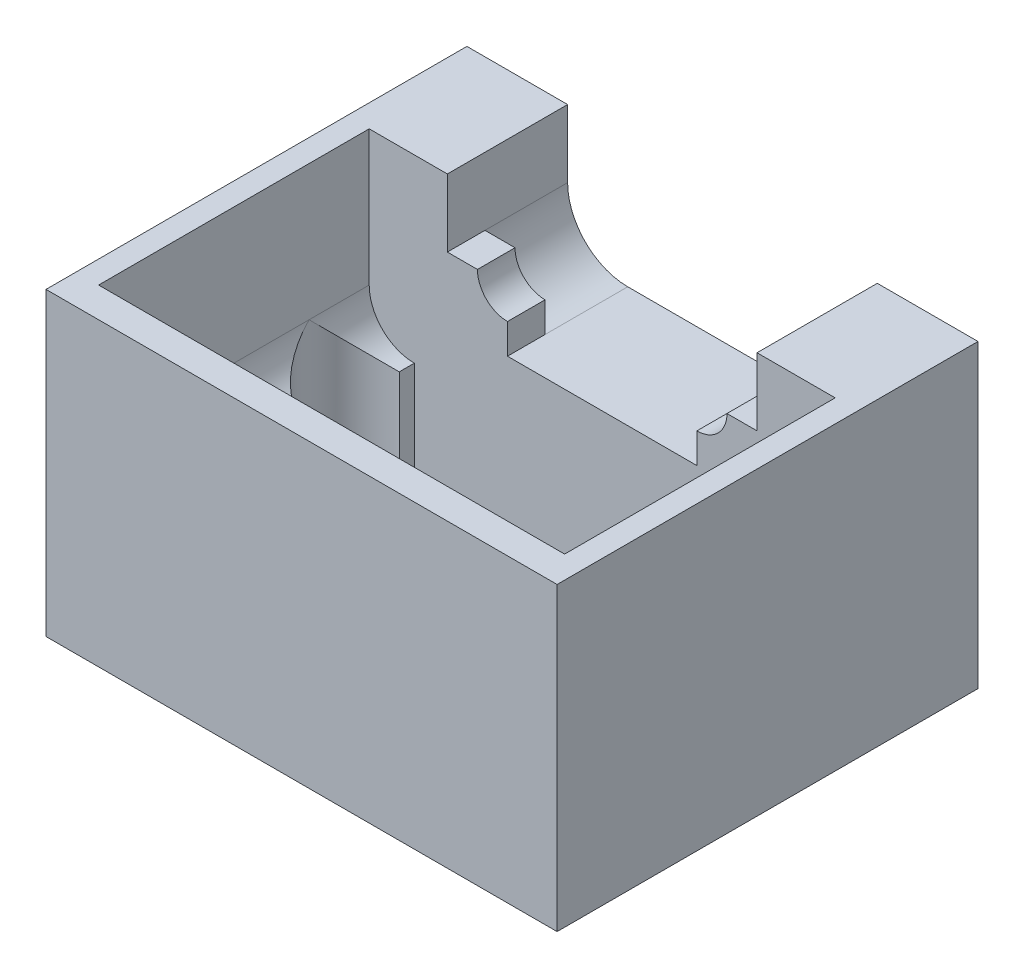
ISO-10303-21;
HEADER;
FILE_DESCRIPTION(('STEP AP214'),'2;1');
FILE_NAME('part.step','',(''),(''),'','','');
FILE_SCHEMA(('AUTOMOTIVE_DESIGN { 1 0 10303 214 1 1 1 1 }'));
ENDSEC;
DATA;
#1=APPLICATION_CONTEXT('core data for automotive mechanical design processes');
#2=APPLICATION_PROTOCOL_DEFINITION('international standard','automotive_design',2000,#1);
#3=PRODUCT_CONTEXT('',#1,'mechanical');
#4=PRODUCT('Part','Part','',(#3));
#5=PRODUCT_RELATED_PRODUCT_CATEGORY('part','',(#4));
#6=PRODUCT_DEFINITION_FORMATION('','',#4);
#7=PRODUCT_DEFINITION_CONTEXT('part definition',#1,'design');
#8=PRODUCT_DEFINITION('design','',#6,#7);
#9=PRODUCT_DEFINITION_SHAPE('','',#8);
#10=(LENGTH_UNIT() NAMED_UNIT(*) SI_UNIT(.MILLI.,.METRE.));
#11=(NAMED_UNIT(*) PLANE_ANGLE_UNIT() SI_UNIT($,.RADIAN.));
#12=(NAMED_UNIT(*) SI_UNIT($,.STERADIAN.) SOLID_ANGLE_UNIT());
#13=UNCERTAINTY_MEASURE_WITH_UNIT(LENGTH_MEASURE(1.E-05),#10,'distance_accuracy_value','');
#14=(GEOMETRIC_REPRESENTATION_CONTEXT(3) GLOBAL_UNCERTAINTY_ASSIGNED_CONTEXT((#13)) GLOBAL_UNIT_ASSIGNED_CONTEXT((#10,
#11,#12)) REPRESENTATION_CONTEXT('',''));
#15=CARTESIAN_POINT('',(0.,0.,0.));
#16=DIRECTION('',(0.,0.,1.));
#17=DIRECTION('',(1.,0.,0.));
#18=AXIS2_PLACEMENT_3D('',#15,#16,#17);
#19=CARTESIAN_POINT('',(6.3,11.5,-5.99999999999999));
#20=DIRECTION('',(1.,0.,0.));
#21=DIRECTION('',(0.,0.,-1.));
#22=AXIS2_PLACEMENT_3D('',#19,#20,#21);
#23=PLANE('',#22);
#24=DIRECTION('',(0.,1.,0.));
#25=VECTOR('',#24,1.);
#26=CARTESIAN_POINT('',(6.3,11.5,-8.5));
#27=LINE('',#26,#25);
#28=CARTESIAN_POINT('',(6.3,11.5,-8.5));
#29=VERTEX_POINT('',#28);
#30=CARTESIAN_POINT('',(6.3,13.5,-8.5));
#31=VERTEX_POINT('',#30);
#32=EDGE_CURVE('E296',#29,#31,#27,.T.);
#33=ORIENTED_EDGE('',*,*,#32,.F.);
#34=DIRECTION('',(0.,0.,-1.));
#35=VECTOR('',#34,1.);
#36=CARTESIAN_POINT('',(6.3,11.5,-5.99999999999999));
#37=LINE('',#36,#35);
#38=CARTESIAN_POINT('',(6.3,11.5,-5.99999999999999));
#39=VERTEX_POINT('',#38);
#40=EDGE_CURVE('E325',#39,#29,#37,.T.);
#41=ORIENTED_EDGE('',*,*,#40,.F.);
#42=DIRECTION('',(0.,1.,0.));
#43=VECTOR('',#42,1.);
#44=CARTESIAN_POINT('',(6.3,11.5,-5.99999999999999));
#45=LINE('',#44,#43);
#46=CARTESIAN_POINT('',(6.3,13.5,-6.));
#47=VERTEX_POINT('',#46);
#48=EDGE_CURVE('E334',#39,#47,#45,.T.);
#49=ORIENTED_EDGE('',*,*,#48,.T.);
#50=DIRECTION('',(0.,0.,1.));
#51=VECTOR('',#50,1.);
#52=CARTESIAN_POINT('',(6.3,13.5,-6.));
#53=LINE('',#52,#51);
#54=EDGE_CURVE('E48',#31,#47,#53,.T.);
#55=ORIENTED_EDGE('',*,*,#54,.F.);
#56=EDGE_LOOP('',(#33,#41,#49,#55));
#57=FACE_BOUND('',#56,.T.);
#58=ADVANCED_FACE('F39',(#57),#23,.F.);
#59=CARTESIAN_POINT('',(-6.3,11.5,-5.99999999999999));
#60=DIRECTION('',(-1.,0.,0.));
#61=DIRECTION('',(0.,0.,1.));
#62=AXIS2_PLACEMENT_3D('',#59,#60,#61);
#63=PLANE('',#62);
#64=DIRECTION('',(0.,-1.,0.));
#65=VECTOR('',#64,1.);
#66=CARTESIAN_POINT('',(-6.3,11.5,-8.5));
#67=LINE('',#66,#65);
#68=CARTESIAN_POINT('',(-6.3,13.5,-8.5));
#69=VERTEX_POINT('',#68);
#70=CARTESIAN_POINT('',(-6.3,11.5,-8.5));
#71=VERTEX_POINT('',#70);
#72=EDGE_CURVE('E311',#69,#71,#67,.T.);
#73=ORIENTED_EDGE('',*,*,#72,.F.);
#74=DIRECTION('',(0.,0.,1.));
#75=VECTOR('',#74,1.);
#76=CARTESIAN_POINT('',(-6.3,13.5,-6.));
#77=LINE('',#76,#75);
#78=CARTESIAN_POINT('',(-6.3,13.5,-6.));
#79=VERTEX_POINT('',#78);
#80=EDGE_CURVE('E532',#79,#69,#77,.F.);
#81=ORIENTED_EDGE('',*,*,#80,.F.);
#82=DIRECTION('',(0.,1.,0.));
#83=VECTOR('',#82,1.);
#84=CARTESIAN_POINT('',(-6.3,11.5,-5.99999999999999));
#85=LINE('',#84,#83);
#86=CARTESIAN_POINT('',(-6.3,11.5,-6.));
#87=VERTEX_POINT('',#86);
#88=EDGE_CURVE('E333',#87,#79,#85,.T.);
#89=ORIENTED_EDGE('',*,*,#88,.F.);
#90=DIRECTION('',(0.,0.,1.));
#91=VECTOR('',#90,1.);
#92=CARTESIAN_POINT('',(-6.3,11.5,-5.99999999999999));
#93=LINE('',#92,#91);
#94=EDGE_CURVE('E315',#71,#87,#93,.T.);
#95=ORIENTED_EDGE('',*,*,#94,.F.);
#96=EDGE_LOOP('',(#73,#81,#89,#95));
#97=FACE_BOUND('',#96,.T.);
#98=ADVANCED_FACE('F574',(#97),#63,.F.);
#99=CARTESIAN_POINT('',(-12.5,2.,-6.));
#100=DIRECTION('',(-1.,0.,0.));
#101=DIRECTION('',(0.,0.,1.));
#102=AXIS2_PLACEMENT_3D('',#99,#100,#101);
#103=PLANE('',#102);
#104=DIRECTION('',(0.,0.,1.));
#105=VECTOR('',#104,1.);
#106=CARTESIAN_POINT('',(-12.5,8.,-14.4852813742386));
#107=LINE('',#106,#105);
#108=CARTESIAN_POINT('',(-12.5,8.,-5.));
#109=VERTEX_POINT('',#108);
#110=CARTESIAN_POINT('',(-12.5,8.,-6.));
#111=VERTEX_POINT('',#110);
#112=EDGE_CURVE('E374',#109,#111,#107,.F.);
#113=ORIENTED_EDGE('',*,*,#112,.F.);
#114=DIRECTION('',(0.,1.,0.));
#115=VECTOR('',#114,1.);
#116=CARTESIAN_POINT('',(-12.5,2.,-5.));
#117=LINE('',#116,#115);
#118=CARTESIAN_POINT('',(-12.5,2.,-5.));
#119=VERTEX_POINT('',#118);
#120=EDGE_CURVE('E448',#119,#109,#117,.T.);
#121=ORIENTED_EDGE('',*,*,#120,.F.);
#122=DIRECTION('',(0.,0.,1.));
#123=VECTOR('',#122,1.);
#124=CARTESIAN_POINT('',(-12.5,2.,-6.));
#125=LINE('',#124,#123);
#126=CARTESIAN_POINT('',(-12.5,2.,-6.));
#127=VERTEX_POINT('',#126);
#128=EDGE_CURVE('E419',#127,#119,#125,.T.);
#129=ORIENTED_EDGE('',*,*,#128,.F.);
#130=DIRECTION('',(0.,1.,0.));
#131=VECTOR('',#130,1.);
#132=CARTESIAN_POINT('',(-12.5,2.,-6.));
#133=LINE('',#132,#131);
#134=EDGE_CURVE('E455',#127,#111,#133,.T.);
#135=ORIENTED_EDGE('',*,*,#134,.T.);
#136=EDGE_LOOP('',(#113,#121,#129,#135));
#137=FACE_BOUND('',#136,.T.);
#138=ADVANCED_FACE('F631',(#137),#103,.F.);
#139=CARTESIAN_POINT('',(12.5,2.,-6.));
#140=DIRECTION('',(-1.,0.,0.));
#141=DIRECTION('',(0.,0.,1.));
#142=AXIS2_PLACEMENT_3D('',#139,#140,#141);
#143=PLANE('',#142);
#144=DIRECTION('',(0.,1.,0.));
#145=VECTOR('',#144,1.);
#146=CARTESIAN_POINT('',(12.5,2.,-5.));
#147=LINE('',#146,#145);
#148=CARTESIAN_POINT('',(12.5,2.,-5.));
#149=VERTEX_POINT('',#148);
#150=CARTESIAN_POINT('',(12.5,8.,-5.));
#151=VERTEX_POINT('',#150);
#152=EDGE_CURVE('E464',#149,#151,#147,.T.);
#153=ORIENTED_EDGE('',*,*,#152,.T.);
#154=DIRECTION('',(0.,0.,1.));
#155=VECTOR('',#154,1.);
#156=CARTESIAN_POINT('',(12.5,8.,-14.4852813742386));
#157=LINE('',#156,#155);
#158=CARTESIAN_POINT('',(12.5,8.,-6.));
#159=VERTEX_POINT('',#158);
#160=EDGE_CURVE('E360',#151,#159,#157,.F.);
#161=ORIENTED_EDGE('',*,*,#160,.T.);
#162=DIRECTION('',(0.,1.,0.));
#163=VECTOR('',#162,1.);
#164=CARTESIAN_POINT('',(12.5,2.,-6.));
#165=LINE('',#164,#163);
#166=CARTESIAN_POINT('',(12.5,2.,-6.));
#167=VERTEX_POINT('',#166);
#168=EDGE_CURVE('E460',#167,#159,#165,.T.);
#169=ORIENTED_EDGE('',*,*,#168,.F.);
#170=DIRECTION('',(0.,0.,1.));
#171=VECTOR('',#170,1.);
#172=CARTESIAN_POINT('',(12.5,2.,-6.));
#173=LINE('',#172,#171);
#174=EDGE_CURVE('E442',#167,#149,#173,.T.);
#175=ORIENTED_EDGE('',*,*,#174,.T.);
#176=EDGE_LOOP('',(#153,#161,#169,#175));
#177=FACE_BOUND('',#176,.T.);
#178=ADVANCED_FACE('F645',(#177),#143,.T.);
#179=CARTESIAN_POINT('',(12.5,2.,-2.));
#180=DIRECTION('',(0.,1.,0.));
#181=DIRECTION('',(0.,0.,1.));
#182=AXIS2_PLACEMENT_3D('',#179,#180,#181);
#183=CYLINDRICAL_SURFACE('',#182,3.);
#184=DIRECTION('',(0.,1.,0.));
#185=VECTOR('',#184,1.);
#186=CARTESIAN_POINT('',(12.5,2.,1.));
#187=LINE('',#186,#185);
#188=CARTESIAN_POINT('',(12.5,2.,1.));
#189=VERTEX_POINT('',#188);
#190=CARTESIAN_POINT('',(12.5,8.,1.));
#191=VERTEX_POINT('',#190);
#192=EDGE_CURVE('E468',#189,#191,#187,.T.);
#193=ORIENTED_EDGE('',*,*,#192,.T.);
#194=CARTESIAN_POINT('',(12.5,11.,-2.));
#195=DIRECTION('',(0.,0.707106781186548,0.707106781186547));
#196=DIRECTION('',(0.,0.707106781186548,-0.707106781186547));
#197=AXIS2_PLACEMENT_3D('',#194,#195,#196);
#198=ELLIPSE('',#197,4.24264068711929,3.);
#199=CARTESIAN_POINT('',(15.5,11.,-2.));
#200=VERTEX_POINT('',#199);
#201=EDGE_CURVE('E367',#191,#200,#198,.T.);
#202=ORIENTED_EDGE('',*,*,#201,.T.);
#203=CARTESIAN_POINT('',(12.5,11.,-2.));
#204=DIRECTION('',(0.,0.707106781186548,-0.707106781186547));
#205=DIRECTION('',(0.,0.707106781186548,0.707106781186547));
#206=AXIS2_PLACEMENT_3D('',#203,#204,#205);
#207=ELLIPSE('',#206,4.24264068711929,3.);
#208=EDGE_CURVE('E350',#200,#151,#207,.T.);
#209=ORIENTED_EDGE('',*,*,#208,.T.);
#210=ORIENTED_EDGE('',*,*,#152,.F.);
#211=CARTESIAN_POINT('',(12.5,2.,-2.));
#212=DIRECTION('',(0.,-1.,0.));
#213=DIRECTION('',(0.,0.,-1.));
#214=AXIS2_PLACEMENT_3D('',#211,#212,#213);
#215=CIRCLE('',#214,3.);
#216=EDGE_CURVE('E439',#149,#189,#215,.T.);
#217=ORIENTED_EDGE('',*,*,#216,.T.);
#218=EDGE_LOOP('',(#193,#202,#209,#210,#217));
#219=FACE_BOUND('',#218,.T.);
#220=ADVANCED_FACE('F648',(#219),#183,.F.);
#221=CARTESIAN_POINT('',(12.5,2.,12.));
#222=DIRECTION('',(1.,0.,0.));
#223=DIRECTION('',(0.,0.,-1.));
#224=AXIS2_PLACEMENT_3D('',#221,#222,#223);
#225=PLANE('',#224);
#226=DIRECTION('',(0.,0.,1.));
#227=VECTOR('',#226,1.);
#228=CARTESIAN_POINT('',(12.5,8.,-14.4852813742386));
#229=LINE('',#228,#227);
#230=CARTESIAN_POINT('',(12.5,8.,12.));
#231=VERTEX_POINT('',#230);
#232=EDGE_CURVE('E364',#191,#231,#229,.T.);
#233=ORIENTED_EDGE('',*,*,#232,.F.);
#234=ORIENTED_EDGE('',*,*,#192,.F.);
#235=DIRECTION('',(0.,0.,-1.));
#236=VECTOR('',#235,1.);
#237=CARTESIAN_POINT('',(12.5,2.,12.));
#238=LINE('',#237,#236);
#239=CARTESIAN_POINT('',(12.5,2.,12.));
#240=VERTEX_POINT('',#239);
#241=EDGE_CURVE('E435',#240,#189,#238,.T.);
#242=ORIENTED_EDGE('',*,*,#241,.F.);
#243=DIRECTION('',(0.,1.,0.));
#244=VECTOR('',#243,1.);
#245=CARTESIAN_POINT('',(12.5,2.,12.));
#246=LINE('',#245,#244);
#247=EDGE_CURVE('E472',#240,#231,#246,.T.);
#248=ORIENTED_EDGE('',*,*,#247,.T.);
#249=EDGE_LOOP('',(#233,#234,#242,#248));
#250=FACE_BOUND('',#249,.T.);
#251=ADVANCED_FACE('F654',(#250),#225,.F.);
#252=CARTESIAN_POINT('',(-12.5,2.,12.));
#253=DIRECTION('',(1.,0.,0.));
#254=DIRECTION('',(0.,0.,-1.));
#255=AXIS2_PLACEMENT_3D('',#252,#253,#254);
#256=PLANE('',#255);
#257=DIRECTION('',(0.,1.,0.));
#258=VECTOR('',#257,1.);
#259=CARTESIAN_POINT('',(-12.5,2.,1.));
#260=LINE('',#259,#258);
#261=CARTESIAN_POINT('',(-12.5,2.,1.));
#262=VERTEX_POINT('',#261);
#263=CARTESIAN_POINT('',(-12.5,8.,1.));
#264=VERTEX_POINT('',#263);
#265=EDGE_CURVE('E480',#262,#264,#260,.T.);
#266=ORIENTED_EDGE('',*,*,#265,.T.);
#267=DIRECTION('',(0.,0.,1.));
#268=VECTOR('',#267,1.);
#269=CARTESIAN_POINT('',(-12.5,8.,-14.4852813742386));
#270=LINE('',#269,#268);
#271=CARTESIAN_POINT('',(-12.5,8.,12.));
#272=VERTEX_POINT('',#271);
#273=EDGE_CURVE('E380',#264,#272,#270,.T.);
#274=ORIENTED_EDGE('',*,*,#273,.T.);
#275=DIRECTION('',(0.,1.,0.));
#276=VECTOR('',#275,1.);
#277=CARTESIAN_POINT('',(-12.5,2.,12.));
#278=LINE('',#277,#276);
#279=CARTESIAN_POINT('',(-12.5,2.,12.));
#280=VERTEX_POINT('',#279);
#281=EDGE_CURVE('E476',#280,#272,#278,.T.);
#282=ORIENTED_EDGE('',*,*,#281,.F.);
#283=DIRECTION('',(0.,0.,-1.));
#284=VECTOR('',#283,1.);
#285=CARTESIAN_POINT('',(-12.5,2.,12.));
#286=LINE('',#285,#284);
#287=EDGE_CURVE('E428',#280,#262,#286,.T.);
#288=ORIENTED_EDGE('',*,*,#287,.T.);
#289=EDGE_LOOP('',(#266,#274,#282,#288));
#290=FACE_BOUND('',#289,.T.);
#291=ADVANCED_FACE('F658',(#290),#256,.T.);
#292=CARTESIAN_POINT('',(-12.5,2.,-2.));
#293=DIRECTION('',(0.,1.,0.));
#294=DIRECTION('',(0.,0.,1.));
#295=AXIS2_PLACEMENT_3D('',#292,#293,#294);
#296=CYLINDRICAL_SURFACE('',#295,3.);
#297=CARTESIAN_POINT('',(-12.5,11.,-2.));
#298=DIRECTION('',(0.,0.707106781186548,0.707106781186547));
#299=DIRECTION('',(0.,0.707106781186548,-0.707106781186547));
#300=AXIS2_PLACEMENT_3D('',#297,#298,#299);
#301=ELLIPSE('',#300,4.24264068711928,3.);
#302=CARTESIAN_POINT('',(-15.5,11.,-2.));
#303=VERTEX_POINT('',#302);
#304=EDGE_CURVE('E377',#264,#303,#301,.F.);
#305=ORIENTED_EDGE('',*,*,#304,.F.);
#306=ORIENTED_EDGE('',*,*,#265,.F.);
#307=CARTESIAN_POINT('',(-12.5,2.,-2.));
#308=DIRECTION('',(0.,1.,0.));
#309=DIRECTION('',(0.,0.,1.));
#310=AXIS2_PLACEMENT_3D('',#307,#308,#309);
#311=CIRCLE('',#310,3.);
#312=EDGE_CURVE('E423',#119,#262,#311,.T.);
#313=ORIENTED_EDGE('',*,*,#312,.F.);
#314=ORIENTED_EDGE('',*,*,#120,.T.);
#315=CARTESIAN_POINT('',(-12.5,11.,-2.));
#316=DIRECTION('',(0.,0.707106781186548,-0.707106781186547));
#317=DIRECTION('',(0.,0.707106781186548,0.707106781186547));
#318=AXIS2_PLACEMENT_3D('',#315,#316,#317);
#319=ELLIPSE('',#318,4.24264068711928,3.);
#320=EDGE_CURVE('E371',#303,#109,#319,.F.);
#321=ORIENTED_EDGE('',*,*,#320,.F.);
#322=EDGE_LOOP('',(#305,#306,#313,#314,#321));
#323=FACE_BOUND('',#322,.T.);
#324=ADVANCED_FACE('F636',(#323),#296,.F.);
#325=CARTESIAN_POINT('',(-17.,20.,14.));
#326=DIRECTION('',(0.,0.,-1.));
#327=DIRECTION('',(-1.,0.,0.));
#328=AXIS2_PLACEMENT_3D('',#325,#326,#327);
#329=PLANE('',#328);
#330=DIRECTION('',(1.,0.,0.));
#331=VECTOR('',#330,1.);
#332=CARTESIAN_POINT('',(-17.,0.,14.));
#333=LINE('',#332,#331);
#334=CARTESIAN_POINT('',(-17.,0.,14.));
#335=VERTEX_POINT('',#334);
#336=CARTESIAN_POINT('',(17.,0.,14.));
#337=VERTEX_POINT('',#336);
#338=EDGE_CURVE('E459',#335,#337,#333,.T.);
#339=ORIENTED_EDGE('',*,*,#338,.T.);
#340=DIRECTION('',(0.,-1.,0.));
#341=VECTOR('',#340,1.);
#342=CARTESIAN_POINT('',(17.,20.,14.));
#343=LINE('',#342,#341);
#344=CARTESIAN_POINT('',(17.,20.,14.));
#345=VERTEX_POINT('',#344);
#346=EDGE_CURVE('E528',#345,#337,#343,.T.);
#347=ORIENTED_EDGE('',*,*,#346,.F.);
#348=DIRECTION('',(1.,0.,0.));
#349=VECTOR('',#348,1.);
#350=CARTESIAN_POINT('',(-17.,20.,14.));
#351=LINE('',#350,#349);
#352=CARTESIAN_POINT('',(-17.,20.,14.));
#353=VERTEX_POINT('',#352);
#354=EDGE_CURVE('E487',#353,#345,#351,.T.);
#355=ORIENTED_EDGE('',*,*,#354,.F.);
#356=DIRECTION('',(0.,-1.,0.));
#357=VECTOR('',#356,1.);
#358=CARTESIAN_POINT('',(-17.,20.,14.));
#359=LINE('',#358,#357);
#360=EDGE_CURVE('E505',#353,#335,#359,.T.);
#361=ORIENTED_EDGE('',*,*,#360,.T.);
#362=EDGE_LOOP('',(#339,#347,#355,#361));
#363=FACE_BOUND('',#362,.T.);
#364=ADVANCED_FACE('F41',(#363),#329,.F.);
#365=CARTESIAN_POINT('',(17.,20.,14.));
#366=DIRECTION('',(-1.,0.,0.));
#367=DIRECTION('',(0.,0.,1.));
#368=AXIS2_PLACEMENT_3D('',#365,#366,#367);
#369=PLANE('',#368);
#370=DIRECTION('',(0.,0.,-1.));
#371=VECTOR('',#370,1.);
#372=CARTESIAN_POINT('',(17.,0.,14.));
#373=LINE('',#372,#371);
#374=CARTESIAN_POINT('',(17.,0.,-14.));
#375=VERTEX_POINT('',#374);
#376=EDGE_CURVE('E509',#337,#375,#373,.T.);
#377=ORIENTED_EDGE('',*,*,#376,.T.);
#378=DIRECTION('',(0.,-1.,0.));
#379=VECTOR('',#378,1.);
#380=CARTESIAN_POINT('',(17.,20.,-14.));
#381=LINE('',#380,#379);
#382=CARTESIAN_POINT('',(17.,20.,-14.));
#383=VERTEX_POINT('',#382);
#384=EDGE_CURVE('E525',#383,#375,#381,.T.);
#385=ORIENTED_EDGE('',*,*,#384,.F.);
#386=DIRECTION('',(0.,0.,-1.));
#387=VECTOR('',#386,1.);
#388=CARTESIAN_POINT('',(17.,20.,14.));
#389=LINE('',#388,#387);
#390=EDGE_CURVE('E491',#345,#383,#389,.T.);
#391=ORIENTED_EDGE('',*,*,#390,.F.);
#392=ORIENTED_EDGE('',*,*,#346,.T.);
#393=EDGE_LOOP('',(#377,#385,#391,#392));
#394=FACE_BOUND('',#393,.T.);
#395=ADVANCED_FACE('F603',(#394),#369,.F.);
#396=CARTESIAN_POINT('',(-17.,20.,-14.));
#397=DIRECTION('',(0.,0.,-1.));
#398=DIRECTION('',(-1.,0.,0.));
#399=AXIS2_PLACEMENT_3D('',#396,#397,#398);
#400=PLANE('',#399);
#401=DIRECTION('',(0.,1.,0.));
#402=VECTOR('',#401,1.);
#403=CARTESIAN_POINT('',(-10.3,15.5,-14.));
#404=LINE('',#403,#402);
#405=CARTESIAN_POINT('',(-10.3,15.5,-14.));
#406=VERTEX_POINT('',#405);
#407=CARTESIAN_POINT('',(-10.3,20.,-14.));
#408=VERTEX_POINT('',#407);
#409=EDGE_CURVE('E268',#406,#408,#404,.T.);
#410=ORIENTED_EDGE('',*,*,#409,.F.);
#411=CARTESIAN_POINT('',(-6.3,15.5,-14.));
#412=DIRECTION('',(0.,0.,1.));
#413=DIRECTION('',(1.,0.,0.));
#414=AXIS2_PLACEMENT_3D('',#411,#412,#413);
#415=CIRCLE('',#414,4.);
#416=CARTESIAN_POINT('',(-6.3,11.5,-14.));
#417=VERTEX_POINT('',#416);
#418=EDGE_CURVE('E308',#406,#417,#415,.T.);
#419=ORIENTED_EDGE('',*,*,#418,.T.);
#420=DIRECTION('',(-1.,0.,0.));
#421=VECTOR('',#420,1.);
#422=CARTESIAN_POINT('',(-6.3,11.5,-14.));
#423=LINE('',#422,#421);
#424=CARTESIAN_POINT('',(6.3,11.5,-14.));
#425=VERTEX_POINT('',#424);
#426=EDGE_CURVE('E329',#425,#417,#423,.T.);
#427=ORIENTED_EDGE('',*,*,#426,.F.);
#428=CARTESIAN_POINT('',(6.3,15.5,-14.));
#429=DIRECTION('',(0.,0.,-1.));
#430=DIRECTION('',(-1.,0.,0.));
#431=AXIS2_PLACEMENT_3D('',#428,#429,#430);
#432=CIRCLE('',#431,4.);
#433=CARTESIAN_POINT('',(10.3,15.5,-14.));
#434=VERTEX_POINT('',#433);
#435=EDGE_CURVE('E293',#434,#425,#432,.T.);
#436=ORIENTED_EDGE('',*,*,#435,.F.);
#437=DIRECTION('',(0.,1.,0.));
#438=VECTOR('',#437,1.);
#439=CARTESIAN_POINT('',(10.3,15.5,-14.));
#440=LINE('',#439,#438);
#441=CARTESIAN_POINT('',(10.3,20.,-14.));
#442=VERTEX_POINT('',#441);
#443=EDGE_CURVE('E272',#434,#442,#440,.T.);
#444=ORIENTED_EDGE('',*,*,#443,.T.);
#445=DIRECTION('',(1.,0.,0.));
#446=VECTOR('',#445,1.);
#447=CARTESIAN_POINT('',(-17.,20.,-14.));
#448=LINE('',#447,#446);
#449=EDGE_CURVE('E496',#442,#383,#448,.T.);
#450=ORIENTED_EDGE('',*,*,#449,.T.);
#451=ORIENTED_EDGE('',*,*,#384,.T.);
#452=DIRECTION('',(1.,0.,0.));
#453=VECTOR('',#452,1.);
#454=CARTESIAN_POINT('',(-17.,0.,-14.));
#455=LINE('',#454,#453);
#456=CARTESIAN_POINT('',(-17.,0.,-14.));
#457=VERTEX_POINT('',#456);
#458=EDGE_CURVE('E513',#457,#375,#455,.T.);
#459=ORIENTED_EDGE('',*,*,#458,.F.);
#460=DIRECTION('',(0.,-1.,0.));
#461=VECTOR('',#460,1.);
#462=CARTESIAN_POINT('',(-17.,20.,-14.));
#463=LINE('',#462,#461);
#464=CARTESIAN_POINT('',(-17.,20.,-14.));
#465=VERTEX_POINT('',#464);
#466=EDGE_CURVE('E522',#465,#457,#463,.T.);
#467=ORIENTED_EDGE('',*,*,#466,.F.);
#468=EDGE_CURVE('E497',#465,#408,#448,.T.);
#469=ORIENTED_EDGE('',*,*,#468,.T.);
#470=EDGE_LOOP('',(#410,#419,#427,#436,#444,#450,#451,#459,#467,#469));
#471=FACE_BOUND('',#470,.T.);
#472=ADVANCED_FACE('F587',(#471),#400,.T.);
#473=CARTESIAN_POINT('',(-17.,20.,14.));
#474=DIRECTION('',(-1.,0.,0.));
#475=DIRECTION('',(0.,0.,1.));
#476=AXIS2_PLACEMENT_3D('',#473,#474,#475);
#477=PLANE('',#476);
#478=DIRECTION('',(0.,0.,-1.));
#479=VECTOR('',#478,1.);
#480=CARTESIAN_POINT('',(-17.,0.,14.));
#481=LINE('',#480,#479);
#482=EDGE_CURVE('E492',#335,#457,#481,.T.);
#483=ORIENTED_EDGE('',*,*,#482,.F.);
#484=ORIENTED_EDGE('',*,*,#360,.F.);
#485=DIRECTION('',(0.,0.,-1.));
#486=VECTOR('',#485,1.);
#487=CARTESIAN_POINT('',(-17.,20.,14.));
#488=LINE('',#487,#486);
#489=EDGE_CURVE('E501',#353,#465,#488,.T.);
#490=ORIENTED_EDGE('',*,*,#489,.T.);
#491=ORIENTED_EDGE('',*,*,#466,.T.);
#492=EDGE_LOOP('',(#483,#484,#490,#491));
#493=FACE_BOUND('',#492,.T.);
#494=ADVANCED_FACE('F595',(#493),#477,.T.);
#495=CARTESIAN_POINT('',(0.,20.,0.));
#496=DIRECTION('',(0.,1.,0.));
#497=DIRECTION('',(0.,0.,1.));
#498=AXIS2_PLACEMENT_3D('',#495,#496,#497);
#499=PLANE('',#498);
#500=DIRECTION('',(0.,0.,1.));
#501=VECTOR('',#500,1.);
#502=CARTESIAN_POINT('',(-10.3,20.,-5.99999999999999));
#503=LINE('',#502,#501);
#504=CARTESIAN_POINT('',(-10.3,20.,-5.99999999999999));
#505=VERTEX_POINT('',#504);
#506=EDGE_CURVE('E244',#408,#505,#503,.T.);
#507=ORIENTED_EDGE('',*,*,#506,.F.);
#508=ORIENTED_EDGE('',*,*,#468,.F.);
#509=ORIENTED_EDGE('',*,*,#489,.F.);
#510=ORIENTED_EDGE('',*,*,#354,.T.);
#511=ORIENTED_EDGE('',*,*,#390,.T.);
#512=ORIENTED_EDGE('',*,*,#449,.F.);
#513=DIRECTION('',(0.,0.,-1.));
#514=VECTOR('',#513,1.);
#515=CARTESIAN_POINT('',(10.3,20.,-5.99999999999999));
#516=LINE('',#515,#514);
#517=CARTESIAN_POINT('',(10.3,20.,-5.99999999999999));
#518=VERTEX_POINT('',#517);
#519=EDGE_CURVE('E238',#518,#442,#516,.T.);
#520=ORIENTED_EDGE('',*,*,#519,.F.);
#521=DIRECTION('',(1.,0.,0.));
#522=VECTOR('',#521,1.);
#523=CARTESIAN_POINT('',(-12.5,20.,-6.));
#524=LINE('',#523,#522);
#525=CARTESIAN_POINT('',(15.5,20.,-6.));
#526=VERTEX_POINT('',#525);
#527=EDGE_CURVE('E452',#518,#526,#524,.T.);
#528=ORIENTED_EDGE('',*,*,#527,.T.);
#529=DIRECTION('',(0.,0.,-1.));
#530=VECTOR('',#529,1.);
#531=CARTESIAN_POINT('',(15.5,20.,12.));
#532=LINE('',#531,#530);
#533=CARTESIAN_POINT('',(15.5,20.,12.));
#534=VERTEX_POINT('',#533);
#535=EDGE_CURVE('E384',#534,#526,#532,.T.);
#536=ORIENTED_EDGE('',*,*,#535,.F.);
#537=DIRECTION('',(1.,0.,0.));
#538=VECTOR('',#537,1.);
#539=CARTESIAN_POINT('',(-12.5,20.,12.));
#540=LINE('',#539,#538);
#541=CARTESIAN_POINT('',(-15.5,20.,12.));
#542=VERTEX_POINT('',#541);
#543=EDGE_CURVE('E407',#542,#534,#540,.T.);
#544=ORIENTED_EDGE('',*,*,#543,.F.);
#545=DIRECTION('',(0.,0.,1.));
#546=VECTOR('',#545,1.);
#547=CARTESIAN_POINT('',(-15.5,20.,-5.99999999999999));
#548=LINE('',#547,#546);
#549=CARTESIAN_POINT('',(-15.5,20.,-5.99999999999999));
#550=VERTEX_POINT('',#549);
#551=EDGE_CURVE('E399',#550,#542,#548,.T.);
#552=ORIENTED_EDGE('',*,*,#551,.F.);
#553=EDGE_CURVE('E424',#550,#505,#524,.T.);
#554=ORIENTED_EDGE('',*,*,#553,.T.);
#555=EDGE_LOOP('',(#507,#508,#509,#510,#511,#512,#520,#528,#536,#544,#552,#554));
#556=FACE_BOUND('',#555,.T.);
#557=ADVANCED_FACE('F592',(#556),#499,.T.);
#558=CARTESIAN_POINT('',(0.,0.,0.));
#559=DIRECTION('',(0.,1.,0.));
#560=DIRECTION('',(0.,0.,1.));
#561=AXIS2_PLACEMENT_3D('',#558,#559,#560);
#562=PLANE('',#561);
#563=ORIENTED_EDGE('',*,*,#338,.F.);
#564=ORIENTED_EDGE('',*,*,#482,.T.);
#565=ORIENTED_EDGE('',*,*,#458,.T.);
#566=ORIENTED_EDGE('',*,*,#376,.F.);
#567=EDGE_LOOP('',(#563,#564,#565,#566));
#568=FACE_BOUND('',#567,.T.);
#569=ADVANCED_FACE('F806',(#568),#562,.F.);
#570=CARTESIAN_POINT('',(-12.5,2.,-6.));
#571=DIRECTION('',(0.,0.,1.));
#572=DIRECTION('',(1.,0.,0.));
#573=AXIS2_PLACEMENT_3D('',#570,#571,#572);
#574=PLANE('',#573);
#575=DIRECTION('',(0.,1.,0.));
#576=VECTOR('',#575,1.);
#577=CARTESIAN_POINT('',(-10.3,15.5,-5.99999999999999));
#578=LINE('',#577,#576);
#579=CARTESIAN_POINT('',(-10.3,15.5,-5.99999999999999));
#580=VERTEX_POINT('',#579);
#581=EDGE_CURVE('E241',#580,#505,#578,.T.);
#582=ORIENTED_EDGE('',*,*,#581,.T.);
#583=ORIENTED_EDGE('',*,*,#553,.F.);
#584=DIRECTION('',(0.,1.,0.));
#585=VECTOR('',#584,1.);
#586=CARTESIAN_POINT('',(-15.5,11.,-5.99999999999999));
#587=LINE('',#586,#585);
#588=CARTESIAN_POINT('',(-15.5,11.,-5.99999999999999));
#589=VERTEX_POINT('',#588);
#590=EDGE_CURVE('E408',#589,#550,#587,.T.);
#591=ORIENTED_EDGE('',*,*,#590,.F.);
#592=CARTESIAN_POINT('',(-12.5,11.,-6.));
#593=DIRECTION('',(0.,0.,1.));
#594=DIRECTION('',(1.,0.,0.));
#595=AXIS2_PLACEMENT_3D('',#592,#593,#594);
#596=CIRCLE('',#595,3.);
#597=EDGE_CURVE('E345',#589,#111,#596,.T.);
#598=ORIENTED_EDGE('',*,*,#597,.T.);
#599=ORIENTED_EDGE('',*,*,#134,.F.);
#600=DIRECTION('',(1.,0.,0.));
#601=VECTOR('',#600,1.);
#602=CARTESIAN_POINT('',(-12.5,2.,-6.));
#603=LINE('',#602,#601);
#604=EDGE_CURVE('E445',#127,#167,#603,.T.);
#605=ORIENTED_EDGE('',*,*,#604,.T.);
#606=ORIENTED_EDGE('',*,*,#168,.T.);
#607=CARTESIAN_POINT('',(12.5,11.,-6.));
#608=DIRECTION('',(0.,0.,1.));
#609=DIRECTION('',(1.,0.,0.));
#610=AXIS2_PLACEMENT_3D('',#607,#608,#609);
#611=CIRCLE('',#610,3.);
#612=CARTESIAN_POINT('',(15.5,11.,-6.));
#613=VERTEX_POINT('',#612);
#614=EDGE_CURVE('E346',#159,#613,#611,.T.);
#615=ORIENTED_EDGE('',*,*,#614,.T.);
#616=DIRECTION('',(0.,1.,0.));
#617=VECTOR('',#616,1.);
#618=CARTESIAN_POINT('',(15.5,11.,-6.));
#619=LINE('',#618,#617);
#620=EDGE_CURVE('E412',#613,#526,#619,.T.);
#621=ORIENTED_EDGE('',*,*,#620,.T.);
#622=ORIENTED_EDGE('',*,*,#527,.F.);
#623=DIRECTION('',(0.,1.,0.));
#624=VECTOR('',#623,1.);
#625=CARTESIAN_POINT('',(10.3,15.5,-5.99999999999999));
#626=LINE('',#625,#624);
#627=CARTESIAN_POINT('',(10.3,15.5,-5.99999999999999));
#628=VERTEX_POINT('',#627);
#629=EDGE_CURVE('E248',#628,#518,#626,.T.);
#630=ORIENTED_EDGE('',*,*,#629,.F.);
#631=DIRECTION('',(1.,0.,0.));
#632=VECTOR('',#631,1.);
#633=CARTESIAN_POINT('',(-10.3,15.5,-5.99999999999999));
#634=LINE('',#633,#632);
#635=CARTESIAN_POINT('',(8.3,15.5,-5.99999999999999));
#636=VERTEX_POINT('',#635);
#637=EDGE_CURVE('E256',#636,#628,#634,.T.);
#638=ORIENTED_EDGE('',*,*,#637,.F.);
#639=CARTESIAN_POINT('',(6.3,15.5,-6.));
#640=DIRECTION('',(0.,0.,-1.));
#641=DIRECTION('',(-1.,0.,0.));
#642=AXIS2_PLACEMENT_3D('',#639,#640,#641);
#643=CIRCLE('',#642,2.);
#644=EDGE_CURVE('E284',#636,#47,#643,.T.);
#645=ORIENTED_EDGE('',*,*,#644,.T.);
#646=ORIENTED_EDGE('',*,*,#48,.F.);
#647=DIRECTION('',(1.,0.,0.));
#648=VECTOR('',#647,1.);
#649=CARTESIAN_POINT('',(-6.3,11.5,-5.99999999999999));
#650=LINE('',#649,#648);
#651=EDGE_CURVE('E320',#87,#39,#650,.T.);
#652=ORIENTED_EDGE('',*,*,#651,.F.);
#653=ORIENTED_EDGE('',*,*,#88,.T.);
#654=CARTESIAN_POINT('',(-6.3,15.5,-6.));
#655=DIRECTION('',(0.,0.,1.));
#656=DIRECTION('',(1.,0.,0.));
#657=AXIS2_PLACEMENT_3D('',#654,#655,#656);
#658=CIRCLE('',#657,2.);
#659=CARTESIAN_POINT('',(-8.3,15.5,-5.99999999999999));
#660=VERTEX_POINT('',#659);
#661=EDGE_CURVE('E253',#660,#79,#658,.T.);
#662=ORIENTED_EDGE('',*,*,#661,.F.);
#663=EDGE_CURVE('E232',#580,#660,#634,.T.);
#664=ORIENTED_EDGE('',*,*,#663,.F.);
#665=EDGE_LOOP('',(#582,#583,#591,#598,#599,#605,#606,#615,#621,#622,#630,#638,#645,#646,#652,
#653,#662,#664));
#666=FACE_BOUND('',#665,.T.);
#667=ADVANCED_FACE('F251',(#666),#574,.T.);
#668=CARTESIAN_POINT('',(-12.5,2.,12.));
#669=DIRECTION('',(0.,0.,1.));
#670=DIRECTION('',(1.,0.,0.));
#671=AXIS2_PLACEMENT_3D('',#668,#669,#670);
#672=PLANE('',#671);
#673=ORIENTED_EDGE('',*,*,#281,.T.);
#674=CARTESIAN_POINT('',(-12.5,11.,12.));
#675=DIRECTION('',(0.,0.,-1.));
#676=DIRECTION('',(-1.,0.,0.));
#677=AXIS2_PLACEMENT_3D('',#674,#675,#676);
#678=CIRCLE('',#677,3.);
#679=CARTESIAN_POINT('',(-15.5,11.,12.));
#680=VERTEX_POINT('',#679);
#681=EDGE_CURVE('E341',#272,#680,#678,.T.);
#682=ORIENTED_EDGE('',*,*,#681,.T.);
#683=DIRECTION('',(0.,1.,0.));
#684=VECTOR('',#683,1.);
#685=CARTESIAN_POINT('',(-15.5,11.,12.));
#686=LINE('',#685,#684);
#687=EDGE_CURVE('E403',#680,#542,#686,.T.);
#688=ORIENTED_EDGE('',*,*,#687,.T.);
#689=ORIENTED_EDGE('',*,*,#543,.T.);
#690=DIRECTION('',(0.,1.,0.));
#691=VECTOR('',#690,1.);
#692=CARTESIAN_POINT('',(15.5,11.,12.));
#693=LINE('',#692,#691);
#694=CARTESIAN_POINT('',(15.5,11.,12.));
#695=VERTEX_POINT('',#694);
#696=EDGE_CURVE('E395',#695,#534,#693,.T.);
#697=ORIENTED_EDGE('',*,*,#696,.F.);
#698=CARTESIAN_POINT('',(12.5,11.,12.));
#699=DIRECTION('',(0.,0.,-1.));
#700=DIRECTION('',(-1.,0.,0.));
#701=AXIS2_PLACEMENT_3D('',#698,#699,#700);
#702=CIRCLE('',#701,3.);
#703=EDGE_CURVE('E338',#695,#231,#702,.T.);
#704=ORIENTED_EDGE('',*,*,#703,.T.);
#705=ORIENTED_EDGE('',*,*,#247,.F.);
#706=DIRECTION('',(1.,0.,0.));
#707=VECTOR('',#706,1.);
#708=CARTESIAN_POINT('',(-12.5,2.,12.));
#709=LINE('',#708,#707);
#710=EDGE_CURVE('E431',#280,#240,#709,.T.);
#711=ORIENTED_EDGE('',*,*,#710,.F.);
#712=EDGE_LOOP('',(#673,#682,#688,#689,#697,#704,#705,#711));
#713=FACE_BOUND('',#712,.T.);
#714=ADVANCED_FACE('F619',(#713),#672,.F.);
#715=CARTESIAN_POINT('',(-12.5,2.,-2.));
#716=DIRECTION('',(0.,1.,0.));
#717=DIRECTION('',(0.,0.,1.));
#718=AXIS2_PLACEMENT_3D('',#715,#716,#717);
#719=PLANE('',#718);
#720=ORIENTED_EDGE('',*,*,#128,.T.);
#721=ORIENTED_EDGE('',*,*,#312,.T.);
#722=ORIENTED_EDGE('',*,*,#287,.F.);
#723=ORIENTED_EDGE('',*,*,#710,.T.);
#724=ORIENTED_EDGE('',*,*,#241,.T.);
#725=ORIENTED_EDGE('',*,*,#216,.F.);
#726=ORIENTED_EDGE('',*,*,#174,.F.);
#727=ORIENTED_EDGE('',*,*,#604,.F.);
#728=EDGE_LOOP('',(#720,#721,#722,#723,#724,#725,#726,#727));
#729=FACE_BOUND('',#728,.T.);
#730=ADVANCED_FACE('F641',(#729),#719,.T.);
#731=CARTESIAN_POINT('',(-15.5,11.,-5.99999999999999));
#732=DIRECTION('',(-1.,0.,0.));
#733=DIRECTION('',(0.,0.,1.));
#734=AXIS2_PLACEMENT_3D('',#731,#732,#733);
#735=PLANE('',#734);
#736=ORIENTED_EDGE('',*,*,#551,.T.);
#737=ORIENTED_EDGE('',*,*,#687,.F.);
#738=DIRECTION('',(0.,0.,1.));
#739=VECTOR('',#738,1.);
#740=CARTESIAN_POINT('',(-15.5,11.,-5.99999999999999));
#741=LINE('',#740,#739);
#742=EDGE_CURVE('E389',#303,#680,#741,.T.);
#743=ORIENTED_EDGE('',*,*,#742,.F.);
#744=EDGE_CURVE('E391',#589,#303,#741,.T.);
#745=ORIENTED_EDGE('',*,*,#744,.F.);
#746=ORIENTED_EDGE('',*,*,#590,.T.);
#747=EDGE_LOOP('',(#736,#737,#743,#745,#746));
#748=FACE_BOUND('',#747,.T.);
#749=ADVANCED_FACE('F623',(#748),#735,.F.);
#750=CARTESIAN_POINT('',(15.5,11.,12.));
#751=DIRECTION('',(1.,0.,0.));
#752=DIRECTION('',(0.,0.,-1.));
#753=AXIS2_PLACEMENT_3D('',#750,#751,#752);
#754=PLANE('',#753);
#755=DIRECTION('',(0.,0.,-1.));
#756=VECTOR('',#755,1.);
#757=CARTESIAN_POINT('',(15.5,11.,12.));
#758=LINE('',#757,#756);
#759=EDGE_CURVE('E385',#695,#200,#758,.T.);
#760=ORIENTED_EDGE('',*,*,#759,.F.);
#761=ORIENTED_EDGE('',*,*,#696,.T.);
#762=ORIENTED_EDGE('',*,*,#535,.T.);
#763=ORIENTED_EDGE('',*,*,#620,.F.);
#764=EDGE_CURVE('E390',#200,#613,#758,.T.);
#765=ORIENTED_EDGE('',*,*,#764,.F.);
#766=EDGE_LOOP('',(#760,#761,#762,#763,#765));
#767=FACE_BOUND('',#766,.T.);
#768=ADVANCED_FACE('F615',(#767),#754,.F.);
#769=CARTESIAN_POINT('',(12.5,11.,-14.4852813742386));
#770=DIRECTION('',(0.,0.,1.));
#771=DIRECTION('',(1.,0.,0.));
#772=AXIS2_PLACEMENT_3D('',#769,#770,#771);
#773=CYLINDRICAL_SURFACE('',#772,3.);
#774=ORIENTED_EDGE('',*,*,#232,.T.);
#775=ORIENTED_EDGE('',*,*,#703,.F.);
#776=ORIENTED_EDGE('',*,*,#759,.T.);
#777=ORIENTED_EDGE('',*,*,#201,.F.);
#778=EDGE_LOOP('',(#774,#775,#776,#777));
#779=FACE_BOUND('',#778,.T.);
#780=ADVANCED_FACE('F652',(#779),#773,.F.);
#781=ORIENTED_EDGE('',*,*,#208,.F.);
#782=ORIENTED_EDGE('',*,*,#764,.T.);
#783=ORIENTED_EDGE('',*,*,#614,.F.);
#784=ORIENTED_EDGE('',*,*,#160,.F.);
#785=EDGE_LOOP('',(#781,#782,#783,#784));
#786=FACE_BOUND('',#785,.T.);
#787=ADVANCED_FACE('F610',(#786),#773,.F.);
#788=CARTESIAN_POINT('',(-12.5,11.,-14.4852813742386));
#789=DIRECTION('',(0.,0.,1.));
#790=DIRECTION('',(1.,0.,0.));
#791=AXIS2_PLACEMENT_3D('',#788,#789,#790);
#792=CYLINDRICAL_SURFACE('',#791,3.);
#793=ORIENTED_EDGE('',*,*,#112,.T.);
#794=ORIENTED_EDGE('',*,*,#597,.F.);
#795=ORIENTED_EDGE('',*,*,#744,.T.);
#796=ORIENTED_EDGE('',*,*,#320,.T.);
#797=EDGE_LOOP('',(#793,#794,#795,#796));
#798=FACE_BOUND('',#797,.T.);
#799=ADVANCED_FACE('F628',(#798),#792,.F.);
#800=ORIENTED_EDGE('',*,*,#304,.T.);
#801=ORIENTED_EDGE('',*,*,#742,.T.);
#802=ORIENTED_EDGE('',*,*,#681,.F.);
#803=ORIENTED_EDGE('',*,*,#273,.F.);
#804=EDGE_LOOP('',(#800,#801,#802,#803));
#805=FACE_BOUND('',#804,.T.);
#806=ADVANCED_FACE('F660',(#805),#792,.F.);
#807=CARTESIAN_POINT('',(0.,11.5,0.));
#808=DIRECTION('',(0.,-1.,0.));
#809=DIRECTION('',(0.,0.,-1.));
#810=AXIS2_PLACEMENT_3D('',#807,#808,#809);
#811=PLANE('',#810);
#812=EDGE_CURVE('E316',#417,#71,#93,.T.);
#813=ORIENTED_EDGE('',*,*,#812,.T.);
#814=ORIENTED_EDGE('',*,*,#94,.T.);
#815=ORIENTED_EDGE('',*,*,#651,.T.);
#816=ORIENTED_EDGE('',*,*,#40,.T.);
#817=EDGE_CURVE('E324',#29,#425,#37,.T.);
#818=ORIENTED_EDGE('',*,*,#817,.T.);
#819=ORIENTED_EDGE('',*,*,#426,.T.);
#820=EDGE_LOOP('',(#813,#814,#815,#816,#818,#819));
#821=FACE_BOUND('',#820,.T.);
#822=ADVANCED_FACE('F566',(#821),#811,.F.);
#823=CARTESIAN_POINT('',(-6.3,15.5,-6.));
#824=DIRECTION('',(0.,0.,1.));
#825=DIRECTION('',(1.,0.,0.));
#826=AXIS2_PLACEMENT_3D('',#823,#824,#825);
#827=CYLINDRICAL_SURFACE('',#826,2.);
#828=DIRECTION('',(0.,0.,1.));
#829=VECTOR('',#828,1.);
#830=CARTESIAN_POINT('',(-8.3,15.5,-6.));
#831=LINE('',#830,#829);
#832=CARTESIAN_POINT('',(-8.3,15.5,-8.5));
#833=VERTEX_POINT('',#832);
#834=EDGE_CURVE('E55',#660,#833,#831,.F.);
#835=ORIENTED_EDGE('',*,*,#834,.F.);
#836=ORIENTED_EDGE('',*,*,#661,.T.);
#837=ORIENTED_EDGE('',*,*,#80,.T.);
#838=CARTESIAN_POINT('',(-6.3,15.5,-8.5));
#839=DIRECTION('',(0.,0.,1.));
#840=DIRECTION('',(1.,0.,0.));
#841=AXIS2_PLACEMENT_3D('',#838,#839,#840);
#842=CIRCLE('',#841,2.);
#843=EDGE_CURVE('E302',#833,#69,#842,.T.);
#844=ORIENTED_EDGE('',*,*,#843,.F.);
#845=EDGE_LOOP('',(#835,#836,#837,#844));
#846=FACE_BOUND('',#845,.T.);
#847=ADVANCED_FACE('F577',(#846),#827,.F.);
#848=CARTESIAN_POINT('',(-6.3,15.5,-6.));
#849=DIRECTION('',(0.,0.,1.));
#850=DIRECTION('',(1.,0.,0.));
#851=AXIS2_PLACEMENT_3D('',#848,#849,#850);
#852=CYLINDRICAL_SURFACE('',#851,4.);
#853=DIRECTION('',(0.,0.,1.));
#854=VECTOR('',#853,1.);
#855=CARTESIAN_POINT('',(-10.3,15.5,-5.99999999999999));
#856=LINE('',#855,#854);
#857=CARTESIAN_POINT('',(-10.3,15.5,-8.5));
#858=VERTEX_POINT('',#857);
#859=EDGE_CURVE('E237',#406,#858,#856,.T.);
#860=ORIENTED_EDGE('',*,*,#859,.T.);
#861=CARTESIAN_POINT('',(-6.3,15.5,-8.5));
#862=DIRECTION('',(0.,0.,1.));
#863=DIRECTION('',(1.,0.,0.));
#864=AXIS2_PLACEMENT_3D('',#861,#862,#863);
#865=CIRCLE('',#864,4.);
#866=EDGE_CURVE('E305',#858,#71,#865,.T.);
#867=ORIENTED_EDGE('',*,*,#866,.T.);
#868=ORIENTED_EDGE('',*,*,#812,.F.);
#869=ORIENTED_EDGE('',*,*,#418,.F.);
#870=EDGE_LOOP('',(#860,#867,#868,#869));
#871=FACE_BOUND('',#870,.T.);
#872=ADVANCED_FACE('F582',(#871),#852,.F.);
#873=CARTESIAN_POINT('',(-6.3,19.5,-8.5));
#874=DIRECTION('',(0.,0.,-1.));
#875=DIRECTION('',(-1.,0.,0.));
#876=AXIS2_PLACEMENT_3D('',#873,#874,#875);
#877=PLANE('',#876);
#878=DIRECTION('',(-1.,0.,0.));
#879=VECTOR('',#878,1.);
#880=CARTESIAN_POINT('',(-6.3,15.5,-8.5));
#881=LINE('',#880,#879);
#882=EDGE_CURVE('E233',#833,#858,#881,.T.);
#883=ORIENTED_EDGE('',*,*,#882,.F.);
#884=ORIENTED_EDGE('',*,*,#843,.T.);
#885=ORIENTED_EDGE('',*,*,#72,.T.);
#886=ORIENTED_EDGE('',*,*,#866,.F.);
#887=EDGE_LOOP('',(#883,#884,#885,#886));
#888=FACE_BOUND('',#887,.T.);
#889=ADVANCED_FACE('F579',(#888),#877,.T.);
#890=CARTESIAN_POINT('',(6.3,15.5,-6.));
#891=DIRECTION('',(0.,0.,1.));
#892=DIRECTION('',(-1.,0.,0.));
#893=AXIS2_PLACEMENT_3D('',#890,#891,#892);
#894=CYLINDRICAL_SURFACE('',#893,2.);
#895=DIRECTION('',(0.,0.,1.));
#896=VECTOR('',#895,1.);
#897=CARTESIAN_POINT('',(8.3,15.5,-6.));
#898=LINE('',#897,#896);
#899=CARTESIAN_POINT('',(8.3,15.5,-8.5));
#900=VERTEX_POINT('',#899);
#901=EDGE_CURVE('E271',#900,#636,#898,.T.);
#902=ORIENTED_EDGE('',*,*,#901,.F.);
#903=CARTESIAN_POINT('',(6.3,15.5,-8.5));
#904=DIRECTION('',(0.,0.,-1.));
#905=DIRECTION('',(-1.,0.,0.));
#906=AXIS2_PLACEMENT_3D('',#903,#904,#905);
#907=CIRCLE('',#906,2.);
#908=EDGE_CURVE('E287',#900,#31,#907,.T.);
#909=ORIENTED_EDGE('',*,*,#908,.T.);
#910=ORIENTED_EDGE('',*,*,#54,.T.);
#911=ORIENTED_EDGE('',*,*,#644,.F.);
#912=EDGE_LOOP('',(#902,#909,#910,#911));
#913=FACE_BOUND('',#912,.T.);
#914=ADVANCED_FACE('F541',(#913),#894,.F.);
#915=CARTESIAN_POINT('',(6.3,15.5,-6.));
#916=DIRECTION('',(0.,0.,1.));
#917=DIRECTION('',(-1.,0.,0.));
#918=AXIS2_PLACEMENT_3D('',#915,#916,#917);
#919=CYLINDRICAL_SURFACE('',#918,4.);
#920=DIRECTION('',(0.,0.,-1.));
#921=VECTOR('',#920,1.);
#922=CARTESIAN_POINT('',(10.3,15.5,-5.99999999999999));
#923=LINE('',#922,#921);
#924=CARTESIAN_POINT('',(10.3,15.5,-8.5));
#925=VERTEX_POINT('',#924);
#926=EDGE_CURVE('E255',#925,#434,#923,.T.);
#927=ORIENTED_EDGE('',*,*,#926,.T.);
#928=ORIENTED_EDGE('',*,*,#435,.T.);
#929=ORIENTED_EDGE('',*,*,#817,.F.);
#930=CARTESIAN_POINT('',(6.3,15.5,-8.5));
#931=DIRECTION('',(0.,0.,-1.));
#932=DIRECTION('',(-1.,0.,0.));
#933=AXIS2_PLACEMENT_3D('',#930,#931,#932);
#934=CIRCLE('',#933,4.);
#935=EDGE_CURVE('E290',#925,#29,#934,.T.);
#936=ORIENTED_EDGE('',*,*,#935,.F.);
#937=EDGE_LOOP('',(#927,#928,#929,#936));
#938=FACE_BOUND('',#937,.T.);
#939=ADVANCED_FACE('F561',(#938),#919,.F.);
#940=CARTESIAN_POINT('',(6.3,19.5,-8.5));
#941=DIRECTION('',(0.,0.,-1.));
#942=DIRECTION('',(1.,0.,0.));
#943=AXIS2_PLACEMENT_3D('',#940,#941,#942);
#944=PLANE('',#943);
#945=DIRECTION('',(-1.,0.,0.));
#946=VECTOR('',#945,1.);
#947=CARTESIAN_POINT('',(6.3,15.5,-8.5));
#948=LINE('',#947,#946);
#949=EDGE_CURVE('E11',#925,#900,#948,.T.);
#950=ORIENTED_EDGE('',*,*,#949,.F.);
#951=ORIENTED_EDGE('',*,*,#935,.T.);
#952=ORIENTED_EDGE('',*,*,#32,.T.);
#953=ORIENTED_EDGE('',*,*,#908,.F.);
#954=EDGE_LOOP('',(#950,#951,#952,#953));
#955=FACE_BOUND('',#954,.T.);
#956=ADVANCED_FACE('F559',(#955),#944,.T.);
#957=CARTESIAN_POINT('',(0.,15.5,0.));
#958=DIRECTION('',(0.,-1.,0.));
#959=DIRECTION('',(0.,0.,-1.));
#960=AXIS2_PLACEMENT_3D('',#957,#958,#959);
#961=PLANE('',#960);
#962=ORIENTED_EDGE('',*,*,#901,.T.);
#963=ORIENTED_EDGE('',*,*,#637,.T.);
#964=EDGE_CURVE('E62',#628,#925,#923,.T.);
#965=ORIENTED_EDGE('',*,*,#964,.T.);
#966=ORIENTED_EDGE('',*,*,#949,.T.);
#967=EDGE_LOOP('',(#962,#963,#965,#966));
#968=FACE_BOUND('',#967,.T.);
#969=ADVANCED_FACE('F550',(#968),#961,.F.);
#970=CARTESIAN_POINT('',(10.3,15.5,-5.99999999999999));
#971=DIRECTION('',(1.,0.,0.));
#972=DIRECTION('',(0.,0.,-1.));
#973=AXIS2_PLACEMENT_3D('',#970,#971,#972);
#974=PLANE('',#973);
#975=ORIENTED_EDGE('',*,*,#519,.T.);
#976=ORIENTED_EDGE('',*,*,#443,.F.);
#977=ORIENTED_EDGE('',*,*,#926,.F.);
#978=ORIENTED_EDGE('',*,*,#964,.F.);
#979=ORIENTED_EDGE('',*,*,#629,.T.);
#980=EDGE_LOOP('',(#975,#976,#977,#978,#979));
#981=FACE_BOUND('',#980,.T.);
#982=ADVANCED_FACE('F552',(#981),#974,.F.);
#983=ORIENTED_EDGE('',*,*,#834,.T.);
#984=ORIENTED_EDGE('',*,*,#882,.T.);
#985=EDGE_CURVE('E228',#858,#580,#856,.T.);
#986=ORIENTED_EDGE('',*,*,#985,.T.);
#987=ORIENTED_EDGE('',*,*,#663,.T.);
#988=EDGE_LOOP('',(#983,#984,#986,#987));
#989=FACE_BOUND('',#988,.T.);
#990=ADVANCED_FACE('F230',(#989),#961,.F.);
#991=CARTESIAN_POINT('',(-10.3,15.5,-5.99999999999999));
#992=DIRECTION('',(-1.,0.,0.));
#993=DIRECTION('',(0.,0.,1.));
#994=AXIS2_PLACEMENT_3D('',#991,#992,#993);
#995=PLANE('',#994);
#996=ORIENTED_EDGE('',*,*,#506,.T.);
#997=ORIENTED_EDGE('',*,*,#581,.F.);
#998=ORIENTED_EDGE('',*,*,#985,.F.);
#999=ORIENTED_EDGE('',*,*,#859,.F.);
#1000=ORIENTED_EDGE('',*,*,#409,.T.);
#1001=EDGE_LOOP('',(#996,#997,#998,#999,#1000));
#1002=FACE_BOUND('',#1001,.T.);
#1003=ADVANCED_FACE('F242',(#1002),#995,.F.);
#1004=CLOSED_SHELL('',(#58,#98,#138,#178,#220,#251,#291,#324,#364,#395,#472,#494,#557,#569,#667,
#714,#730,#749,#768,#780,#787,#799,#806,#822,#847,#872,#889,#914,#939,#956,#969,#982,#990,#1003));
#1005=MANIFOLD_SOLID_BREP('B2',#1004);
#1006=ADVANCED_BREP_SHAPE_REPRESENTATION('',(#18,#1005),#14);
#1007=SHAPE_DEFINITION_REPRESENTATION(#9,#1006);
ENDSEC;
END-ISO-10303-21;
